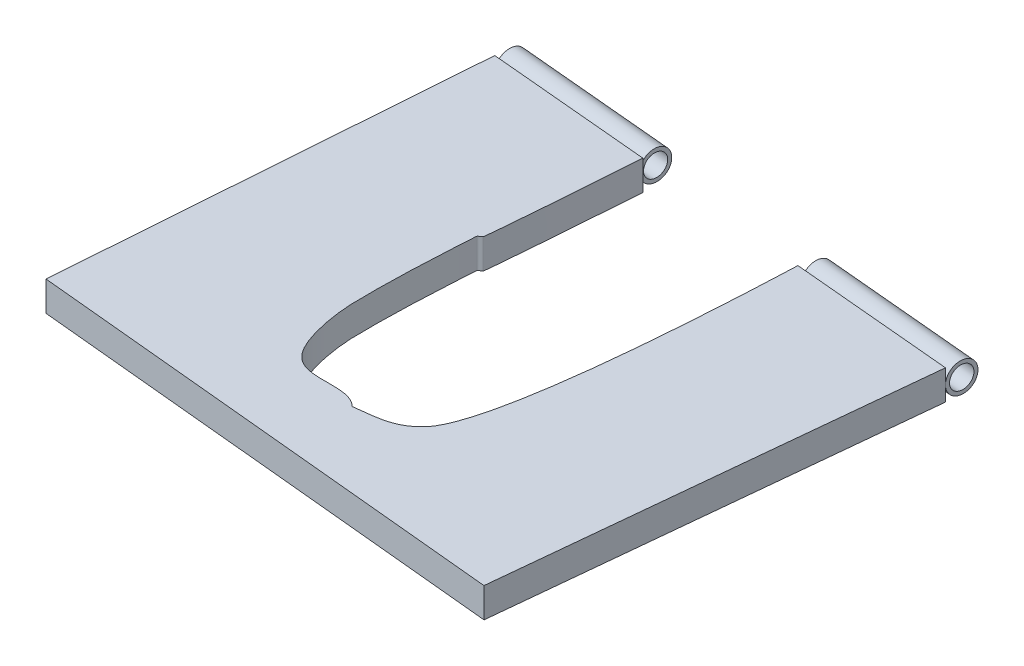
ISO-10303-21;
HEADER;
FILE_DESCRIPTION(('STEP AP214'),'2;1');
FILE_NAME('part.step','',(''),(''),'','','');
FILE_SCHEMA(('AUTOMOTIVE_DESIGN { 1 0 10303 214 1 1 1 1 }'));
ENDSEC;
DATA;
#1=APPLICATION_CONTEXT('core data for automotive mechanical design processes');
#2=APPLICATION_PROTOCOL_DEFINITION('international standard','automotive_design',2000,#1);
#3=PRODUCT_CONTEXT('',#1,'mechanical');
#4=PRODUCT('Part','Part','',(#3));
#5=PRODUCT_RELATED_PRODUCT_CATEGORY('part','',(#4));
#6=PRODUCT_DEFINITION_FORMATION('','',#4);
#7=PRODUCT_DEFINITION_CONTEXT('part definition',#1,'design');
#8=PRODUCT_DEFINITION('design','',#6,#7);
#9=PRODUCT_DEFINITION_SHAPE('','',#8);
#10=(LENGTH_UNIT() NAMED_UNIT(*) SI_UNIT(.MILLI.,.METRE.));
#11=(NAMED_UNIT(*) PLANE_ANGLE_UNIT() SI_UNIT($,.RADIAN.));
#12=(NAMED_UNIT(*) SI_UNIT($,.STERADIAN.) SOLID_ANGLE_UNIT());
#13=UNCERTAINTY_MEASURE_WITH_UNIT(LENGTH_MEASURE(1.E-05),#10,'distance_accuracy_value','');
#14=(GEOMETRIC_REPRESENTATION_CONTEXT(3) GLOBAL_UNCERTAINTY_ASSIGNED_CONTEXT((#13)) GLOBAL_UNIT_ASSIGNED_CONTEXT((#10,
#11,#12)) REPRESENTATION_CONTEXT('',''));
#15=CARTESIAN_POINT('',(0.,0.,0.));
#16=DIRECTION('',(0.,0.,1.));
#17=DIRECTION('',(1.,0.,0.));
#18=AXIS2_PLACEMENT_3D('',#15,#16,#17);
#19=CARTESIAN_POINT('',(34.7504135457772,31.1296901829789,44.8964777600716));
#20=DIRECTION('',(-0.995893206467704,0.,-0.0905357460425181));
#21=DIRECTION('',(-0.0204361975291275,0.974191019937647,0.224798172820418));
#22=AXIS2_PLACEMENT_3D('',#19,#20,#21);
#23=CYLINDRICAL_SURFACE('',#22,0.5);
#24=CARTESIAN_POINT('',(17.0533912668461,31.129690182979,43.287657552896));
#25=DIRECTION('',(0.995893206467704,0.,0.0905357460425181));
#26=DIRECTION('',(0.0204361975291275,-0.974191019937647,-0.224798172820418));
#27=AXIS2_PLACEMENT_3D('',#24,#25,#26);
#28=CIRCLE('',#27,0.5);
#29=CARTESIAN_POINT('',(17.0636093656106,30.6425946730101,43.1752584664858));
#30=VERTEX_POINT('',#29);
#31=EDGE_CURVE('P0_E56',#30,#30,#28,.T.);
#32=ORIENTED_EDGE('',*,*,#31,.T.);
#33=EDGE_LOOP('',(#32));
#34=FACE_BOUND('',#33,.T.);
#35=CARTESIAN_POINT('',(22.4068114217559,31.129690182979,43.7743321124333));
#36=DIRECTION('',(-0.995893206467704,0.,-0.0905357460425158));
#37=DIRECTION('',(-0.0905357460425158,0.,0.995893206467704));
#38=AXIS2_PLACEMENT_3D('',#35,#36,#37);
#39=CIRCLE('',#38,0.5);
#40=CARTESIAN_POINT('',(22.3615435487346,31.129690182979,44.2722787156671));
#41=VERTEX_POINT('',#40);
#42=EDGE_CURVE('P0_E46',#41,#41,#39,.T.);
#43=ORIENTED_EDGE('',*,*,#42,.T.);
#44=EDGE_LOOP('',(#43));
#45=FACE_BOUND('',#44,.T.);
#46=ADVANCED_FACE('P0_F42',(#34,#45),#23,.T.);
#47=CARTESIAN_POINT('',(34.7504135457772,31.1296901829789,44.8964777600716));
#48=DIRECTION('',(-0.995893206467704,0.,-0.0905357460425181));
#49=DIRECTION('',(-0.0204361975291275,0.974191019937647,0.224798172820418));
#50=AXIS2_PLACEMENT_3D('',#47,#48,#49);
#51=CYLINDRICAL_SURFACE('',#50,0.375);
#52=CARTESIAN_POINT('',(22.4068114217559,31.129690182979,43.7743321124333));
#53=DIRECTION('',(-0.995893206467704,0.,-0.0905357460425158));
#54=DIRECTION('',(-0.0905357460425158,0.,0.995893206467704));
#55=AXIS2_PLACEMENT_3D('',#52,#53,#54);
#56=CIRCLE('',#55,0.375);
#57=CARTESIAN_POINT('',(22.3728605169899,31.129690182979,44.1477920648587));
#58=VERTEX_POINT('',#57);
#59=EDGE_CURVE('P0_E11',#58,#58,#56,.T.);
#60=ORIENTED_EDGE('',*,*,#59,.F.);
#61=EDGE_LOOP('',(#60));
#62=FACE_BOUND('',#61,.T.);
#63=CARTESIAN_POINT('',(17.0533912668461,31.129690182979,43.287657552896));
#64=DIRECTION('',(0.995893206467704,0.,0.0905357460425181));
#65=DIRECTION('',(0.0204361975291275,-0.974191019937647,-0.224798172820418));
#66=AXIS2_PLACEMENT_3D('',#63,#64,#65);
#67=CIRCLE('',#66,0.375);
#68=CARTESIAN_POINT('',(17.0610548409195,30.7643685505024,43.2033582380884));
#69=VERTEX_POINT('',#68);
#70=EDGE_CURVE('P0_E50',#69,#69,#67,.T.);
#71=ORIENTED_EDGE('',*,*,#70,.F.);
#72=EDGE_LOOP('',(#71));
#73=FACE_BOUND('',#72,.T.);
#74=ADVANCED_FACE('P0_F44',(#62,#73),#51,.F.);
#75=CARTESIAN_POINT('',(17.0533912668461,31.129690182979,43.287657552896));
#76=DIRECTION('',(0.995893206467704,0.,0.0905357460425181));
#77=DIRECTION('',(0.0204361975291275,-0.974191019937647,-0.224798172820418));
#78=AXIS2_PLACEMENT_3D('',#75,#76,#77);
#79=PLANE('',#78);
#80=ORIENTED_EDGE('',*,*,#31,.F.);
#81=EDGE_LOOP('',(#80));
#82=FACE_BOUND('',#81,.T.);
#83=ORIENTED_EDGE('',*,*,#70,.T.);
#84=EDGE_LOOP('',(#83));
#85=FACE_BOUND('',#84,.T.);
#86=ADVANCED_FACE('P0_F66',(#82,#85),#79,.F.);
#87=CARTESIAN_POINT('',(22.3615435487346,30.1056901829782,44.2722787156676));
#88=DIRECTION('',(-0.995893206467704,0.,-0.0905357460425158));
#89=DIRECTION('',(-0.0905357460425158,0.,0.995893206467704));
#90=AXIS2_PLACEMENT_3D('',#87,#88,#89);
#91=PLANE('',#90);
#92=ORIENTED_EDGE('',*,*,#59,.T.);
#93=EDGE_LOOP('',(#92));
#94=FACE_BOUND('',#93,.T.);
#95=ORIENTED_EDGE('',*,*,#42,.F.);
#96=EDGE_LOOP('',(#95));
#97=FACE_BOUND('',#96,.T.);
#98=ADVANCED_FACE('P0_F64',(#94,#97),#91,.F.);
#99=CLOSED_SHELL('',(#46,#74,#86,#98));
#100=MANIFOLD_SOLID_BREP('P0_B2',#99);
#101=CARTESIAN_POINT('',(34.7504135457772,31.1296901829789,44.8964777600716));
#102=DIRECTION('',(-0.995893206467704,0.,-0.0905357460425181));
#103=DIRECTION('',(-0.0204361975291275,0.974191019937647,0.224798172820418));
#104=AXIS2_PLACEMENT_3D('',#101,#102,#103);
#105=CYLINDRICAL_SURFACE('',#104,0.5);
#106=CARTESIAN_POINT('',(28.3821706605621,31.129690182979,44.3175465886884));
#107=DIRECTION('',(0.995893206467704,0.,0.0905357460425172));
#108=DIRECTION('',(0.0905357460425172,0.,-0.995893206467704));
#109=AXIS2_PLACEMENT_3D('',#106,#107,#108);
#110=CIRCLE('',#109,0.5);
#111=CARTESIAN_POINT('',(28.4274385335834,31.129690182979,43.8195999854546));
#112=VERTEX_POINT('',#111);
#113=EDGE_CURVE('P0_E115',#112,#112,#110,.T.);
#114=ORIENTED_EDGE('',*,*,#113,.T.);
#115=EDGE_LOOP('',(#114));
#116=FACE_BOUND('',#115,.T.);
#117=CARTESIAN_POINT('',(33.7322827896745,31.1296901829789,44.8039204186077));
#118=DIRECTION('',(-0.994989942750527,0.,-0.0999750660179937));
#119=DIRECTION('',(-0.0999750660179937,1.46296990762586E-13,0.994989942750528));
#120=AXIS2_PLACEMENT_3D('',#117,#118,#119);
#121=ELLIPSE('',#120,0.500022480172407,0.5);
#122=CARTESIAN_POINT('',(33.6822930092087,31.129690182979,45.3014377575284));
#123=VERTEX_POINT('',#122);
#124=EDGE_CURVE('P0_E41',#123,#123,#121,.T.);
#125=ORIENTED_EDGE('',*,*,#124,.T.);
#126=EDGE_LOOP('',(#125));
#127=FACE_BOUND('',#126,.T.);
#128=ADVANCED_FACE('P0_F103',(#116,#127),#105,.T.);
#129=CARTESIAN_POINT('',(37.8519616348542,0.,3.80330714991351));
#130=DIRECTION('',(-0.994989942750527,0.,-0.0999750660179937));
#131=DIRECTION('',(-0.0999750660179937,0.,0.994989942750528));
#132=AXIS2_PLACEMENT_3D('',#129,#130,#131);
#133=PLANE('',#132);
#134=CARTESIAN_POINT('',(33.7322827896745,31.1296901829789,44.8039204186077));
#135=DIRECTION('',(-0.994989942750527,0.,-0.0999750660179937));
#136=DIRECTION('',(-0.0999750660179937,1.46296990762586E-13,0.994989942750528));
#137=AXIS2_PLACEMENT_3D('',#134,#135,#136);
#138=ELLIPSE('',#137,0.375016860129305,0.375);
#139=CARTESIAN_POINT('',(33.6947904543252,31.129690182979,45.1770584227982));
#140=VERTEX_POINT('',#139);
#141=EDGE_CURVE('P0_E110',#140,#140,#138,.T.);
#142=ORIENTED_EDGE('',*,*,#141,.T.);
#143=EDGE_LOOP('',(#142));
#144=FACE_BOUND('',#143,.T.);
#145=ORIENTED_EDGE('',*,*,#124,.F.);
#146=EDGE_LOOP('',(#145));
#147=FACE_BOUND('',#146,.T.);
#148=ADVANCED_FACE('P0_F129',(#144,#147),#133,.F.);
#149=CARTESIAN_POINT('',(34.7504135457772,31.1296901829789,44.8964777600716));
#150=DIRECTION('',(-0.995893206467704,0.,-0.0905357460425181));
#151=DIRECTION('',(-0.0204361975291275,0.974191019937647,0.224798172820418));
#152=AXIS2_PLACEMENT_3D('',#149,#150,#151);
#153=CYLINDRICAL_SURFACE('',#152,0.375);
#154=CARTESIAN_POINT('',(28.3821706605621,31.129690182979,44.3175465886884));
#155=DIRECTION('',(0.995893206467704,0.,0.0905357460425172));
#156=DIRECTION('',(0.0905357460425172,0.,-0.995893206467704));
#157=AXIS2_PLACEMENT_3D('',#154,#155,#156);
#158=CIRCLE('',#157,0.375);
#159=CARTESIAN_POINT('',(28.4161215653281,31.129690182979,43.944086636263));
#160=VERTEX_POINT('',#159);
#161=EDGE_CURVE('P0_E106',#160,#160,#158,.T.);
#162=ORIENTED_EDGE('',*,*,#161,.F.);
#163=EDGE_LOOP('',(#162));
#164=FACE_BOUND('',#163,.T.);
#165=ORIENTED_EDGE('',*,*,#141,.F.);
#166=EDGE_LOOP('',(#165));
#167=FACE_BOUND('',#166,.T.);
#168=ADVANCED_FACE('P0_F126',(#164,#167),#153,.F.);
#169=CARTESIAN_POINT('',(28.5106365531336,30.1056901829782,42.9044217704023));
#170=DIRECTION('',(0.995893206467704,0.,0.0905357460425172));
#171=DIRECTION('',(0.0905357460425172,0.,-0.995893206467704));
#172=AXIS2_PLACEMENT_3D('',#169,#170,#171);
#173=PLANE('',#172);
#174=ORIENTED_EDGE('',*,*,#161,.T.);
#175=EDGE_LOOP('',(#174));
#176=FACE_BOUND('',#175,.T.);
#177=ORIENTED_EDGE('',*,*,#113,.F.);
#178=EDGE_LOOP('',(#177));
#179=FACE_BOUND('',#178,.T.);
#180=ADVANCED_FACE('P0_F123',(#176,#179),#173,.F.);
#181=CLOSED_SHELL('',(#128,#148,#168,#180));
#182=MANIFOLD_SOLID_BREP('P0_B6',#181);
#183=CARTESIAN_POINT('',(15.9697648684168,31.6296901829782,57.8414880481262));
#184=DIRECTION('',(0.997287156444047,0.,0.0736092901184895));
#185=DIRECTION('',(0.0736092901184895,0.,-0.997287156444047));
#186=AXIS2_PLACEMENT_3D('',#183,#184,#185);
#187=PLANE('',#186);
#188=DIRECTION('',(-0.0736092901184895,0.,0.997287156444047));
#189=VECTOR('',#188,1.);
#190=CARTESIAN_POINT('',(15.9697648684168,31.6296901829782,57.8414880481262));
#191=LINE('',#190,#189);
#192=CARTESIAN_POINT('',(17.0072289667738,31.6296901829782,43.7855228445802));
#193=VERTEX_POINT('',#192);
#194=CARTESIAN_POINT('',(15.9697648684168,31.6296901829782,57.8414880481262));
#195=VERTEX_POINT('',#194);
#196=EDGE_CURVE('P1_E86',#193,#195,#191,.T.);
#197=ORIENTED_EDGE('',*,*,#196,.F.);
#198=DIRECTION('',(0.,1.,0.));
#199=VECTOR('',#198,1.);
#200=CARTESIAN_POINT('',(17.0072289667738,18.6296901829782,43.7855228445802));
#201=LINE('',#200,#199);
#202=CARTESIAN_POINT('',(17.0072289667738,30.6296901829782,43.7855228445802));
#203=VERTEX_POINT('',#202);
#204=EDGE_CURVE('P1_E73',#203,#193,#201,.T.);
#205=ORIENTED_EDGE('',*,*,#204,.F.);
#206=DIRECTION('',(-0.0736092901184895,0.,0.997287156444047));
#207=VECTOR('',#206,1.);
#208=CARTESIAN_POINT('',(15.9697648684168,30.6296901829782,57.8414880481262));
#209=LINE('',#208,#207);
#210=CARTESIAN_POINT('',(15.9697648684168,30.6296901829782,57.8414880481262));
#211=VERTEX_POINT('',#210);
#212=EDGE_CURVE('P1_E172',#203,#211,#209,.T.);
#213=ORIENTED_EDGE('',*,*,#212,.T.);
#214=DIRECTION('',(0.,-1.,0.));
#215=VECTOR('',#214,1.);
#216=CARTESIAN_POINT('',(15.9697648684168,31.6296901829782,57.8414880481262));
#217=LINE('',#216,#215);
#218=EDGE_CURVE('P1_E94',#195,#211,#217,.T.);
#219=ORIENTED_EDGE('',*,*,#218,.F.);
#220=EDGE_LOOP('',(#197,#205,#213,#219));
#221=FACE_BOUND('',#220,.T.);
#222=ADVANCED_FACE('P1_F16',(#221),#187,.F.);
#223=CARTESIAN_POINT('',(37.7403382212975,31.6296901829782,4.91422588483536));
#224=DIRECTION('',(-0.994989942750527,0.,-0.0999750660179952));
#225=DIRECTION('',(-0.0999750660179952,0.,0.994989942750527));
#226=AXIS2_PLACEMENT_3D('',#223,#224,#225);
#227=PLANE('',#226);
#228=DIRECTION('',(0.0999750660179952,0.,-0.994989942750527));
#229=VECTOR('',#228,1.);
#230=CARTESIAN_POINT('',(37.7403382212975,30.6296901829782,4.91422588483536));
#231=LINE('',#230,#229);
#232=CARTESIAN_POINT('',(32.2651042044054,30.6296901829782,59.4058406243811));
#233=VERTEX_POINT('',#232);
#234=CARTESIAN_POINT('',(33.6822930092087,30.6296901829782,45.3014377575288));
#235=VERTEX_POINT('',#234);
#236=EDGE_CURVE('P1_E106',#233,#235,#231,.T.);
#237=ORIENTED_EDGE('',*,*,#236,.T.);
#238=DIRECTION('',(0.,1.,0.));
#239=VECTOR('',#238,1.);
#240=CARTESIAN_POINT('',(33.6822930092087,18.6296901829782,45.3014377575288));
#241=LINE('',#240,#239);
#242=CARTESIAN_POINT('',(33.6822930092087,31.6296901829782,45.3014377575288));
#243=VERTEX_POINT('',#242);
#244=EDGE_CURVE('P1_E81',#235,#243,#241,.T.);
#245=ORIENTED_EDGE('',*,*,#244,.T.);
#246=DIRECTION('',(0.0999750660179952,0.,-0.994989942750527));
#247=VECTOR('',#246,1.);
#248=CARTESIAN_POINT('',(37.7403382212975,31.6296901829782,4.91422588483536));
#249=LINE('',#248,#247);
#250=CARTESIAN_POINT('',(32.2651042044054,31.6296901829782,59.4058406243811));
#251=VERTEX_POINT('',#250);
#252=EDGE_CURVE('P1_E103',#251,#243,#249,.T.);
#253=ORIENTED_EDGE('',*,*,#252,.F.);
#254=DIRECTION('',(0.,-1.,0.));
#255=VECTOR('',#254,1.);
#256=CARTESIAN_POINT('',(32.2651042044054,31.6296901829782,59.4058406243811));
#257=LINE('',#256,#255);
#258=EDGE_CURVE('P1_E98',#251,#233,#257,.T.);
#259=ORIENTED_EDGE('',*,*,#258,.T.);
#260=EDGE_LOOP('',(#237,#245,#253,#259));
#261=FACE_BOUND('',#260,.T.);
#262=ADVANCED_FACE('P1_F18',(#261),#227,.F.);
#263=CARTESIAN_POINT('',(13.5908414124328,31.6296901829782,-5.77525055695748));
#264=DIRECTION('',(0.,1.,0.));
#265=DIRECTION('',(0.,0.,1.));
#266=AXIS2_PLACEMENT_3D('',#263,#264,#265);
#267=PLANE('',#266);
#268=DIRECTION('',(0.995893206467704,0.,0.090535746042518));
#269=VECTOR('',#268,1.);
#270=CARTESIAN_POINT('',(33.6822930092087,31.6296901829782,45.3014377575288));
#271=LINE('',#270,#269);
#272=CARTESIAN_POINT('',(22.4879006028122,31.6296901829782,44.2837657205837));
#273=VERTEX_POINT('',#272);
#274=EDGE_CURVE('P1_E37',#193,#273,#271,.T.);
#275=ORIENTED_EDGE('',*,*,#274,.F.);
#276=ORIENTED_EDGE('',*,*,#196,.T.);
#277=DIRECTION('',(0.995423607840516,0.,0.0955606663526895));
#278=VECTOR('',#277,1.);
#279=CARTESIAN_POINT('',(32.2651042044054,31.6296901829782,59.4058406243811));
#280=LINE('',#279,#278);
#281=EDGE_CURVE('P1_E97',#195,#251,#280,.T.);
#282=ORIENTED_EDGE('',*,*,#281,.T.);
#283=ORIENTED_EDGE('',*,*,#252,.T.);
#284=CARTESIAN_POINT('',(28.2238600490802,31.6296901829782,44.8052165793354));
#285=VERTEX_POINT('',#284);
#286=EDGE_CURVE('P1_E91',#285,#243,#271,.T.);
#287=ORIENTED_EDGE('',*,*,#286,.F.);
#288=CARTESIAN_POINT('',(24.8344294671946,31.6296901829782,56.4074981865592));
#289=CARTESIAN_POINT('',(25.5225872731461,31.6296901829782,56.3091899285661));
#290=CARTESIAN_POINT('',(26.1314527476319,31.6296901829782,56.3365448108324));
#291=CARTESIAN_POINT('',(26.6595074728253,31.6296901829782,55.7556846131197));
#292=CARTESIAN_POINT('',(27.9254673416004,31.6296901829782,54.3631287574671));
#293=CARTESIAN_POINT('',(28.2097819920166,31.6296901829782,45.0023093782261));
#294=CARTESIAN_POINT('',(28.2238600490802,31.6296901829782,44.8052165793354));
#295=B_SPLINE_CURVE_WITH_KNOTS('',3,(#288,#289,#290,#291,#292,#293,#294),.UNSPECIFIED.,.F.,.F.,
(4,3,4),(0.,1.,2.),.UNSPECIFIED.);
#296=CARTESIAN_POINT('',(24.8344294671946,31.6296901829782,56.4074981865592));
#297=VERTEX_POINT('',#296);
#298=EDGE_CURVE('P1_E114',#297,#285,#295,.T.);
#299=ORIENTED_EDGE('',*,*,#298,.F.);
#300=CARTESIAN_POINT('',(22.4879006028122,31.6296901829782,44.2837657205837));
#301=CARTESIAN_POINT('',(22.3575378881243,31.6296901829782,45.9350267732972));
#302=CARTESIAN_POINT('',(22.2658129650469,31.6296901829782,47.5897939423152));
#303=CARTESIAN_POINT('',(22.0968124587485,31.6296901829782,49.2375488787242));
#304=CARTESIAN_POINT('',(22.0905424204097,31.6296901829782,49.2986817525272));
#305=CARTESIAN_POINT('',(21.9702831126253,31.6296901829782,49.3065776963761));
#306=CARTESIAN_POINT('',(21.9664497440606,31.6296901829782,49.3679115934122));
#307=CARTESIAN_POINT('',(21.882377407944,31.6296901829782,50.7130689712775));
#308=CARTESIAN_POINT('',(21.8047517325583,31.6296901829782,52.0617379857183));
#309=CARTESIAN_POINT('',(21.8360870293727,31.6296901829782,53.4091557487373));
#310=CARTESIAN_POINT('',(21.8485990852348,31.6296901829782,53.9471741508096));
#311=CARTESIAN_POINT('',(22.0236882936501,31.6296901829782,55.2251562597915));
#312=CARTESIAN_POINT('',(22.4879006028122,31.6296901829782,55.7556846131197));
#313=CARTESIAN_POINT('',(23.1125514676541,31.6296901829782,56.4695713157961));
#314=CARTESIAN_POINT('',(24.2285650433756,31.6296901829782,55.8016337627403));
#315=CARTESIAN_POINT('',(24.8344294671946,31.6296901829782,56.4074981865592));
#316=B_SPLINE_CURVE_WITH_KNOTS('',3,(#300,#301,#302,#303,#304,#305,#306,#307,#308,#309,#310,
#311,#312,#313,#314,#315),.UNSPECIFIED.,.F.,.F.,(4,3,3,3,3,4),(0.,1.,2.,3.,4.,5.),.UNSPECIFIED.);
#317=EDGE_CURVE('P1_E20',#273,#297,#316,.T.);
#318=ORIENTED_EDGE('',*,*,#317,.F.);
#319=EDGE_LOOP('',(#275,#276,#282,#283,#287,#299,#318));
#320=FACE_BOUND('',#319,.T.);
#321=ADVANCED_FACE('P1_F85',(#320),#267,.T.);
#322=CARTESIAN_POINT('',(13.5908414124328,30.6296901829782,-5.77525055695748));
#323=DIRECTION('',(0.,1.,0.));
#324=DIRECTION('',(0.,0.,1.));
#325=AXIS2_PLACEMENT_3D('',#322,#323,#324);
#326=PLANE('',#325);
#327=ORIENTED_EDGE('',*,*,#212,.F.);
#328=DIRECTION('',(0.995893206467704,0.,0.090535746042518));
#329=VECTOR('',#328,1.);
#330=CARTESIAN_POINT('',(9.15025026601825,30.6296901829782,43.0712520536024));
#331=LINE('',#330,#329);
#332=CARTESIAN_POINT('',(22.4879006028122,30.6296901829782,44.2837657205837));
#333=VERTEX_POINT('',#332);
#334=EDGE_CURVE('P1_E76',#203,#333,#331,.T.);
#335=ORIENTED_EDGE('',*,*,#334,.T.);
#336=CARTESIAN_POINT('',(22.4879006028122,30.6296901829782,44.2837657205837));
#337=CARTESIAN_POINT('',(22.3575378881243,30.6296901829782,45.9350267732972));
#338=CARTESIAN_POINT('',(22.2658129650469,30.6296901829782,47.5897939423152));
#339=CARTESIAN_POINT('',(22.0968124587485,30.6296901829782,49.2375488787242));
#340=CARTESIAN_POINT('',(22.0905424204097,30.6296901829782,49.2986817525272));
#341=CARTESIAN_POINT('',(21.9702831126253,30.6296901829782,49.3065776963761));
#342=CARTESIAN_POINT('',(21.9664497440606,30.6296901829782,49.3679115934122));
#343=CARTESIAN_POINT('',(21.882377407944,30.6296901829782,50.7130689712775));
#344=CARTESIAN_POINT('',(21.8047517325583,30.6296901829782,52.0617379857183));
#345=CARTESIAN_POINT('',(21.8360870293727,30.6296901829782,53.4091557487373));
#346=CARTESIAN_POINT('',(21.8485990852348,30.6296901829782,53.9471741508096));
#347=CARTESIAN_POINT('',(22.0236882936501,30.6296901829782,55.2251562597915));
#348=CARTESIAN_POINT('',(22.4879006028122,30.6296901829782,55.7556846131197));
#349=CARTESIAN_POINT('',(23.1125514676541,30.6296901829782,56.4695713157961));
#350=CARTESIAN_POINT('',(24.2285650433756,30.6296901829782,55.8016337627403));
#351=CARTESIAN_POINT('',(24.8344294671946,30.6296901829782,56.4074981865592));
#352=B_SPLINE_CURVE_WITH_KNOTS('',3,(#336,#337,#338,#339,#340,#341,#342,#343,#344,#345,#346,
#347,#348,#349,#350,#351),.UNSPECIFIED.,.F.,.F.,(4,3,3,3,3,4),(0.,1.,2.,3.,4.,5.),.UNSPECIFIED.);
#353=CARTESIAN_POINT('',(24.8344294671946,30.6296901829782,56.4074981865592));
#354=VERTEX_POINT('',#353);
#355=EDGE_CURVE('P1_E125',#333,#354,#352,.T.);
#356=ORIENTED_EDGE('',*,*,#355,.T.);
#357=CARTESIAN_POINT('',(24.8344294671946,30.6296901829782,56.4074981865592));
#358=CARTESIAN_POINT('',(25.5225872731461,30.6296901829782,56.3091899285661));
#359=CARTESIAN_POINT('',(26.1314527476319,30.6296901829782,56.3365448108324));
#360=CARTESIAN_POINT('',(26.6595074728253,30.6296901829782,55.7556846131197));
#361=CARTESIAN_POINT('',(27.9254673416004,30.6296901829782,54.3631287574671));
#362=CARTESIAN_POINT('',(28.2097819920166,30.6296901829782,45.0023093782261));
#363=CARTESIAN_POINT('',(28.2238600490802,30.6296901829782,44.8052165793354));
#364=B_SPLINE_CURVE_WITH_KNOTS('',3,(#357,#358,#359,#360,#361,#362,#363),.UNSPECIFIED.,.F.,.F.,
(4,3,4),(0.,1.,2.),.UNSPECIFIED.);
#365=CARTESIAN_POINT('',(28.2238600490802,30.6296901829782,44.8052165793354));
#366=VERTEX_POINT('',#365);
#367=EDGE_CURVE('P1_E118',#354,#366,#364,.T.);
#368=ORIENTED_EDGE('',*,*,#367,.T.);
#369=EDGE_CURVE('P1_E185',#366,#235,#331,.T.);
#370=ORIENTED_EDGE('',*,*,#369,.T.);
#371=ORIENTED_EDGE('',*,*,#236,.F.);
#372=DIRECTION('',(0.995423607840516,0.,0.0955606663526895));
#373=VECTOR('',#372,1.);
#374=CARTESIAN_POINT('',(32.2651042044054,30.6296901829782,59.4058406243811));
#375=LINE('',#374,#373);
#376=EDGE_CURVE('P1_E124',#211,#233,#375,.T.);
#377=ORIENTED_EDGE('',*,*,#376,.F.);
#378=EDGE_LOOP('',(#327,#335,#356,#368,#370,#371,#377));
#379=FACE_BOUND('',#378,.T.);
#380=ADVANCED_FACE('P1_F161',(#379),#326,.F.);
#381=CARTESIAN_POINT('',(32.2651042044054,31.6296901829782,59.4058406243811));
#382=DIRECTION('',(0.0955606663526895,0.,-0.995423607840516));
#383=DIRECTION('',(-0.995423607840516,0.,-0.0955606663526896));
#384=AXIS2_PLACEMENT_3D('',#381,#382,#383);
#385=PLANE('',#384);
#386=ORIENTED_EDGE('',*,*,#376,.T.);
#387=ORIENTED_EDGE('',*,*,#258,.F.);
#388=ORIENTED_EDGE('',*,*,#281,.F.);
#389=ORIENTED_EDGE('',*,*,#218,.T.);
#390=EDGE_LOOP('',(#386,#387,#388,#389));
#391=FACE_BOUND('',#390,.T.);
#392=ADVANCED_FACE('P1_F182',(#391),#385,.F.);
#393=DIRECTION('',(0.,-1.,0.));
#394=VECTOR('',#393,1.);
#395=SURFACE_OF_LINEAR_EXTRUSION('',#316,#394);
#396=ORIENTED_EDGE('',*,*,#355,.F.);
#397=DIRECTION('',(0.,-1.,0.));
#398=VECTOR('',#397,1.);
#399=CARTESIAN_POINT('',(22.4879006028122,31.6296901829782,44.2837657205837));
#400=LINE('',#399,#398);
#401=EDGE_CURVE('P1_E11',#273,#333,#400,.T.);
#402=ORIENTED_EDGE('',*,*,#401,.F.);
#403=ORIENTED_EDGE('',*,*,#317,.T.);
#404=DIRECTION('',(0.,-1.,0.));
#405=VECTOR('',#404,1.);
#406=CARTESIAN_POINT('',(24.8344294671946,31.6296901829782,56.4074981865592));
#407=LINE('',#406,#405);
#408=EDGE_CURVE('P1_E110',#297,#354,#407,.T.);
#409=ORIENTED_EDGE('',*,*,#408,.T.);
#410=EDGE_LOOP('',(#396,#402,#403,#409));
#411=FACE_BOUND('',#410,.T.);
#412=ADVANCED_FACE('P1_F149',(#411),#395,.T.);
#413=DIRECTION('',(0.,-1.,0.));
#414=VECTOR('',#413,1.);
#415=SURFACE_OF_LINEAR_EXTRUSION('',#295,#414);
#416=ORIENTED_EDGE('',*,*,#367,.F.);
#417=ORIENTED_EDGE('',*,*,#408,.F.);
#418=ORIENTED_EDGE('',*,*,#298,.T.);
#419=DIRECTION('',(0.,-1.,0.));
#420=VECTOR('',#419,1.);
#421=CARTESIAN_POINT('',(28.2238600490802,31.6296901829782,44.8052165793354));
#422=LINE('',#421,#420);
#423=EDGE_CURVE('P1_E30',#285,#366,#422,.T.);
#424=ORIENTED_EDGE('',*,*,#423,.T.);
#425=EDGE_LOOP('',(#416,#417,#418,#424));
#426=FACE_BOUND('',#425,.T.);
#427=ADVANCED_FACE('P1_F145',(#426),#415,.T.);
#428=CARTESIAN_POINT('',(33.6822930092087,18.6296901829782,45.3014377575288));
#429=DIRECTION('',(-0.090535746042518,0.,0.995893206467704));
#430=DIRECTION('',(0.995893206467704,0.,0.090535746042518));
#431=AXIS2_PLACEMENT_3D('',#428,#429,#430);
#432=PLANE('',#431);
#433=ORIENTED_EDGE('',*,*,#423,.F.);
#434=ORIENTED_EDGE('',*,*,#286,.T.);
#435=ORIENTED_EDGE('',*,*,#244,.F.);
#436=ORIENTED_EDGE('',*,*,#369,.F.);
#437=EDGE_LOOP('',(#433,#434,#435,#436));
#438=FACE_BOUND('',#437,.T.);
#439=ADVANCED_FACE('P1_F148',(#438),#432,.F.);
#440=ORIENTED_EDGE('',*,*,#204,.T.);
#441=ORIENTED_EDGE('',*,*,#274,.T.);
#442=ORIENTED_EDGE('',*,*,#401,.T.);
#443=ORIENTED_EDGE('',*,*,#334,.F.);
#444=EDGE_LOOP('',(#440,#441,#442,#443));
#445=FACE_BOUND('',#444,.T.);
#446=ADVANCED_FACE('P1_F74',(#445),#432,.F.);
#447=CLOSED_SHELL('',(#222,#262,#321,#380,#392,#412,#427,#439,#446));
#448=MANIFOLD_SOLID_BREP('P1_B1',#447);
#449=ADVANCED_BREP_SHAPE_REPRESENTATION('',(#18,#100,#182,#448),#14);
#450=SHAPE_DEFINITION_REPRESENTATION(#9,#449);
ENDSEC;
END-ISO-10303-21;
